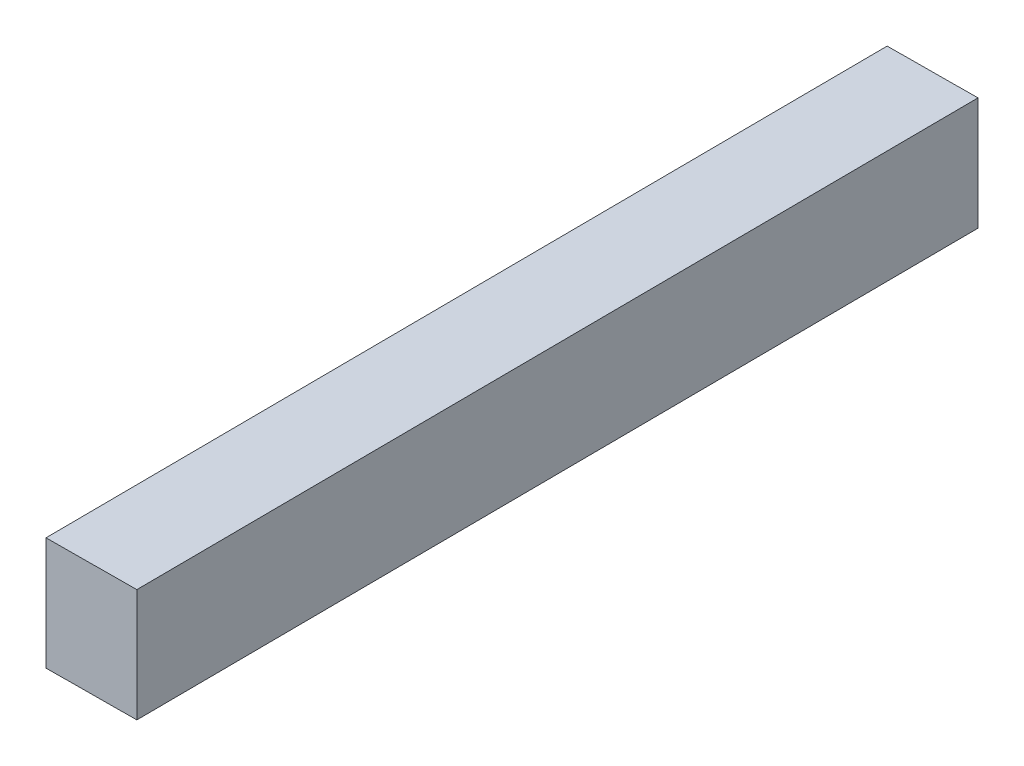
ISO-10303-21;
HEADER;
FILE_DESCRIPTION(('STEP AP214'),'2;1');
FILE_NAME('part.step','',(''),(''),'','','');
FILE_SCHEMA(('AUTOMOTIVE_DESIGN { 1 0 10303 214 1 1 1 1 }'));
ENDSEC;
DATA;
#1=APPLICATION_CONTEXT('core data for automotive mechanical design processes');
#2=APPLICATION_PROTOCOL_DEFINITION('international standard','automotive_design',2000,#1);
#3=PRODUCT_CONTEXT('',#1,'mechanical');
#4=PRODUCT('Part','Part','',(#3));
#5=PRODUCT_RELATED_PRODUCT_CATEGORY('part','',(#4));
#6=PRODUCT_DEFINITION_FORMATION('','',#4);
#7=PRODUCT_DEFINITION_CONTEXT('part definition',#1,'design');
#8=PRODUCT_DEFINITION('design','',#6,#7);
#9=PRODUCT_DEFINITION_SHAPE('','',#8);
#10=(LENGTH_UNIT() NAMED_UNIT(*) SI_UNIT(.MILLI.,.METRE.));
#11=(NAMED_UNIT(*) PLANE_ANGLE_UNIT() SI_UNIT($,.RADIAN.));
#12=(NAMED_UNIT(*) SI_UNIT($,.STERADIAN.) SOLID_ANGLE_UNIT());
#13=UNCERTAINTY_MEASURE_WITH_UNIT(LENGTH_MEASURE(1.E-05),#10,'distance_accuracy_value','');
#14=(GEOMETRIC_REPRESENTATION_CONTEXT(3) GLOBAL_UNCERTAINTY_ASSIGNED_CONTEXT((#13)) GLOBAL_UNIT_ASSIGNED_CONTEXT((#10,
#11,#12)) REPRESENTATION_CONTEXT('',''));
#15=CARTESIAN_POINT('',(0.,0.,0.));
#16=DIRECTION('',(0.,0.,1.));
#17=DIRECTION('',(1.,0.,0.));
#18=AXIS2_PLACEMENT_3D('',#15,#16,#17);
#19=CARTESIAN_POINT('',(-0.212518484328352,7.874,-17.9959807436708));
#20=DIRECTION('',(0.999980479570007,0.,-0.00624823806673125));
#21=DIRECTION('',(-0.00624823806673125,0.,-0.999980479570007));
#22=AXIS2_PLACEMENT_3D('',#19,#20,#21);
#23=PLANE('',#22);
#24=DIRECTION('',(0.,1.,0.));
#25=VECTOR('',#24,1.);
#26=CARTESIAN_POINT('',(-0.212518484328352,7.874,-17.9959807436708));
#27=LINE('',#26,#25);
#28=CARTESIAN_POINT('',(-0.212518484328352,7.62,-17.9959807436708));
#29=VERTEX_POINT('',#28);
#30=CARTESIAN_POINT('',(-0.212518484328352,7.874,-17.9959807436708));
#31=VERTEX_POINT('',#30);
#32=EDGE_CURVE('E20',#29,#31,#27,.T.);
#33=ORIENTED_EDGE('',*,*,#32,.T.);
#34=DIRECTION('',(-0.00624823806673098,0.,-0.999980479570007));
#35=VECTOR('',#34,1.);
#36=CARTESIAN_POINT('',(-0.212518484328352,7.874,-17.9959807436708));
#37=LINE('',#36,#35);
#38=CARTESIAN_POINT('',(-0.224421377845476,7.874,-19.9009435572519));
#39=VERTEX_POINT('',#38);
#40=EDGE_CURVE('E55',#31,#39,#37,.T.);
#41=ORIENTED_EDGE('',*,*,#40,.T.);
#42=DIRECTION('',(0.,1.,0.));
#43=VECTOR('',#42,1.);
#44=CARTESIAN_POINT('',(-0.224421377845476,7.874,-19.9009435572519));
#45=LINE('',#44,#43);
#46=CARTESIAN_POINT('',(-0.224421377845476,7.62,-19.9009435572519));
#47=VERTEX_POINT('',#46);
#48=EDGE_CURVE('E76',#39,#47,#45,.F.);
#49=ORIENTED_EDGE('',*,*,#48,.T.);
#50=DIRECTION('',(-0.00624823806673098,0.,-0.999980479570007));
#51=VECTOR('',#50,1.);
#52=CARTESIAN_POINT('',(-0.212518484328352,7.62,-17.9959807436708));
#53=LINE('',#52,#51);
#54=EDGE_CURVE('E58',#29,#47,#53,.T.);
#55=ORIENTED_EDGE('',*,*,#54,.F.);
#56=EDGE_LOOP('',(#33,#41,#49,#55));
#57=FACE_BOUND('',#56,.T.);
#58=ADVANCED_FACE('F17',(#57),#23,.F.);
#59=CARTESIAN_POINT('',(-0.212518484328352,7.874,-17.9959807436708));
#60=DIRECTION('',(-0.00624823806638445,0.,-0.999980479570009));
#61=DIRECTION('',(-0.999980479570009,0.,0.00624823806638445));
#62=AXIS2_PLACEMENT_3D('',#59,#60,#61);
#63=PLANE('',#62);
#64=DIRECTION('',(0.,1.,0.));
#65=VECTOR('',#64,1.);
#66=CARTESIAN_POINT('',(-0.00932245087972418,7.874,-17.9972503856459));
#67=LINE('',#66,#65);
#68=CARTESIAN_POINT('',(-0.0093224508797241,7.62,-17.9972503856459));
#69=VERTEX_POINT('',#68);
#70=CARTESIAN_POINT('',(-0.0093224508797241,7.874,-17.9972503856459));
#71=VERTEX_POINT('',#70);
#72=EDGE_CURVE('E73',#69,#71,#67,.T.);
#73=ORIENTED_EDGE('',*,*,#72,.T.);
#74=DIRECTION('',(-0.999980479570009,0.,0.00624823806643566));
#75=VECTOR('',#74,1.);
#76=CARTESIAN_POINT('',(-0.00932245087972419,7.874,-17.9972503856459));
#77=LINE('',#76,#75);
#78=EDGE_CURVE('E63',#71,#31,#77,.T.);
#79=ORIENTED_EDGE('',*,*,#78,.T.);
#80=ORIENTED_EDGE('',*,*,#32,.F.);
#81=DIRECTION('',(-0.999980479570009,0.,0.00624823806643566));
#82=VECTOR('',#81,1.);
#83=CARTESIAN_POINT('',(-0.00932245087972419,7.62,-17.9972503856459));
#84=LINE('',#83,#82);
#85=EDGE_CURVE('E80',#69,#29,#84,.T.);
#86=ORIENTED_EDGE('',*,*,#85,.F.);
#87=EDGE_LOOP('',(#73,#79,#80,#86));
#88=FACE_BOUND('',#87,.T.);
#89=ADVANCED_FACE('F72',(#88),#63,.F.);
#90=CARTESIAN_POINT('',(-0.212518484328352,7.874,-17.9959807436708));
#91=DIRECTION('',(0.,-1.,0.));
#92=DIRECTION('',(0.,0.,-1.));
#93=AXIS2_PLACEMENT_3D('',#90,#91,#92);
#94=PLANE('',#93);
#95=ORIENTED_EDGE('',*,*,#78,.F.);
#96=DIRECTION('',(0.00624823806672968,0.,0.999980479570007));
#97=VECTOR('',#96,1.);
#98=CARTESIAN_POINT('',(-0.00932245087972418,7.874,-17.9972503856459));
#99=LINE('',#98,#97);
#100=CARTESIAN_POINT('',(-0.0212253443987782,7.874,-19.9022131995363));
#101=VERTEX_POINT('',#100);
#102=EDGE_CURVE('E83',#71,#101,#99,.F.);
#103=ORIENTED_EDGE('',*,*,#102,.T.);
#104=DIRECTION('',(0.999980479560498,0.,-0.00624823958862128));
#105=VECTOR('',#104,1.);
#106=CARTESIAN_POINT('',(-0.224421377845476,7.874,-19.9009435572519));
#107=LINE('',#106,#105);
#108=EDGE_CURVE('E69',#101,#39,#107,.F.);
#109=ORIENTED_EDGE('',*,*,#108,.T.);
#110=ORIENTED_EDGE('',*,*,#40,.F.);
#111=EDGE_LOOP('',(#95,#103,#109,#110));
#112=FACE_BOUND('',#111,.T.);
#113=ADVANCED_FACE('F66',(#112),#94,.F.);
#114=CARTESIAN_POINT('',(-0.224421377845476,7.874,-19.9009435572519));
#115=DIRECTION('',(0.00624823958862128,0.,0.999980479560498));
#116=DIRECTION('',(0.999980479560498,0.,-0.00624823958862128));
#117=AXIS2_PLACEMENT_3D('',#114,#115,#116);
#118=PLANE('',#117);
#119=ORIENTED_EDGE('',*,*,#48,.F.);
#120=ORIENTED_EDGE('',*,*,#108,.F.);
#121=DIRECTION('',(0.,1.,0.));
#122=VECTOR('',#121,1.);
#123=CARTESIAN_POINT('',(-0.0212253443987783,7.874,-19.9022131995363));
#124=LINE('',#123,#122);
#125=CARTESIAN_POINT('',(-0.0212253443987782,7.62,-19.9022131995363));
#126=VERTEX_POINT('',#125);
#127=EDGE_CURVE('E26',#101,#126,#124,.F.);
#128=ORIENTED_EDGE('',*,*,#127,.T.);
#129=DIRECTION('',(0.999980479560498,0.,-0.00624823958857006));
#130=VECTOR('',#129,1.);
#131=CARTESIAN_POINT('',(-0.224421377845476,7.62,-19.9009435572519));
#132=LINE('',#131,#130);
#133=EDGE_CURVE('E34',#47,#126,#132,.T.);
#134=ORIENTED_EDGE('',*,*,#133,.F.);
#135=EDGE_LOOP('',(#119,#120,#128,#134));
#136=FACE_BOUND('',#135,.T.);
#137=ADVANCED_FACE('F88',(#136),#118,.F.);
#138=CARTESIAN_POINT('',(-0.212518484328352,7.62,-17.9959807436708));
#139=DIRECTION('',(0.,-1.,0.));
#140=DIRECTION('',(0.,0.,-1.));
#141=AXIS2_PLACEMENT_3D('',#138,#139,#140);
#142=PLANE('',#141);
#143=DIRECTION('',(0.00624823806672968,0.,0.999980479570007));
#144=VECTOR('',#143,1.);
#145=CARTESIAN_POINT('',(-0.00932245087972418,7.62,-17.9972503856459));
#146=LINE('',#145,#144);
#147=EDGE_CURVE('E11',#126,#69,#146,.T.);
#148=ORIENTED_EDGE('',*,*,#147,.T.);
#149=ORIENTED_EDGE('',*,*,#85,.T.);
#150=ORIENTED_EDGE('',*,*,#54,.T.);
#151=ORIENTED_EDGE('',*,*,#133,.T.);
#152=EDGE_LOOP('',(#148,#149,#150,#151));
#153=FACE_BOUND('',#152,.T.);
#154=ADVANCED_FACE('F91',(#153),#142,.T.);
#155=CARTESIAN_POINT('',(-0.00932245087972418,7.874,-17.9972503856459));
#156=DIRECTION('',(-0.999980479570007,0.,0.00624823806672968));
#157=DIRECTION('',(0.00624823806672968,0.,0.999980479570007));
#158=AXIS2_PLACEMENT_3D('',#155,#156,#157);
#159=PLANE('',#158);
#160=ORIENTED_EDGE('',*,*,#127,.F.);
#161=ORIENTED_EDGE('',*,*,#102,.F.);
#162=ORIENTED_EDGE('',*,*,#72,.F.);
#163=ORIENTED_EDGE('',*,*,#147,.F.);
#164=EDGE_LOOP('',(#160,#161,#162,#163));
#165=FACE_BOUND('',#164,.T.);
#166=ADVANCED_FACE('F90',(#165),#159,.F.);
#167=CLOSED_SHELL('',(#58,#89,#113,#137,#154,#166));
#168=MANIFOLD_SOLID_BREP('B1',#167);
#169=ADVANCED_BREP_SHAPE_REPRESENTATION('',(#18,#168),#14);
#170=SHAPE_DEFINITION_REPRESENTATION(#9,#169);
ENDSEC;
END-ISO-10303-21;
